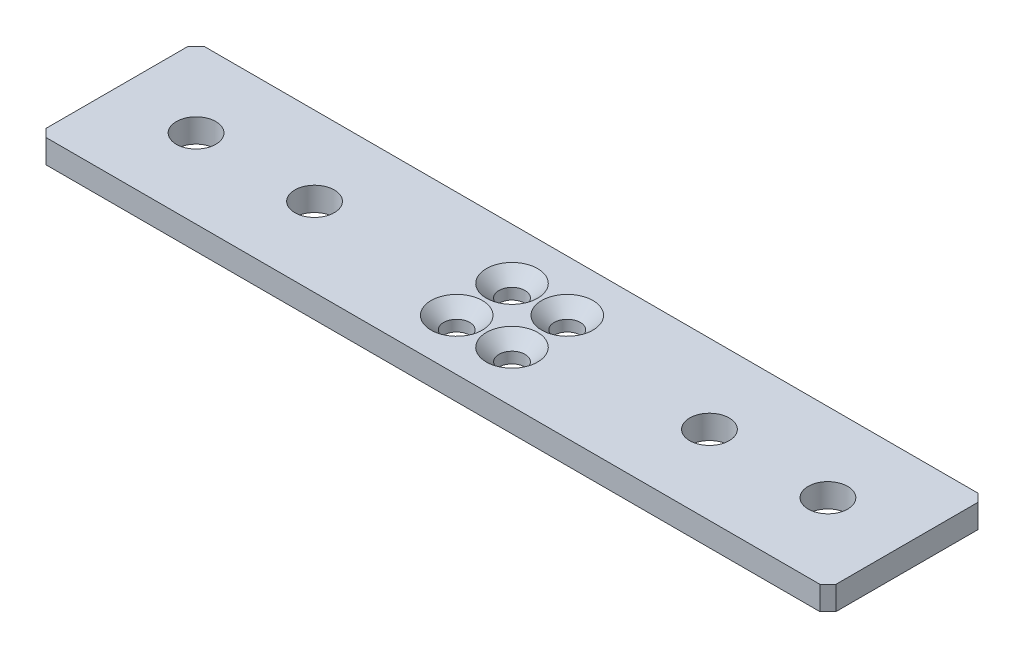
ISO-10303-21;
HEADER;
FILE_DESCRIPTION(('STEP AP214'),'2;1');
FILE_NAME('part.step','',(''),(''),'','','');
FILE_SCHEMA(('AUTOMOTIVE_DESIGN { 1 0 10303 214 1 1 1 1 }'));
ENDSEC;
DATA;
#1=APPLICATION_CONTEXT('core data for automotive mechanical design processes');
#2=APPLICATION_PROTOCOL_DEFINITION('international standard','automotive_design',2000,#1);
#3=PRODUCT_CONTEXT('',#1,'mechanical');
#4=PRODUCT('Part','Part','',(#3));
#5=PRODUCT_RELATED_PRODUCT_CATEGORY('part','',(#4));
#6=PRODUCT_DEFINITION_FORMATION('','',#4);
#7=PRODUCT_DEFINITION_CONTEXT('part definition',#1,'design');
#8=PRODUCT_DEFINITION('design','',#6,#7);
#9=PRODUCT_DEFINITION_SHAPE('','',#8);
#10=(LENGTH_UNIT() NAMED_UNIT(*) SI_UNIT(.MILLI.,.METRE.));
#11=(NAMED_UNIT(*) PLANE_ANGLE_UNIT() SI_UNIT($,.RADIAN.));
#12=(NAMED_UNIT(*) SI_UNIT($,.STERADIAN.) SOLID_ANGLE_UNIT());
#13=UNCERTAINTY_MEASURE_WITH_UNIT(LENGTH_MEASURE(1.E-05),#10,'distance_accuracy_value','');
#14=(GEOMETRIC_REPRESENTATION_CONTEXT(3) GLOBAL_UNCERTAINTY_ASSIGNED_CONTEXT((#13)) GLOBAL_UNIT_ASSIGNED_CONTEXT((#10,
#11,#12)) REPRESENTATION_CONTEXT('',''));
#15=CARTESIAN_POINT('',(0.,0.,0.));
#16=DIRECTION('',(0.,0.,1.));
#17=DIRECTION('',(1.,0.,0.));
#18=AXIS2_PLACEMENT_3D('',#15,#16,#17);
#19=CARTESIAN_POINT('',(100.,6.,20.));
#20=DIRECTION('',(0.,0.,-1.));
#21=DIRECTION('',(-1.,0.,0.));
#22=AXIS2_PLACEMENT_3D('',#19,#20,#21);
#23=PLANE('',#22);
#24=DIRECTION('',(1.,0.,0.));
#25=VECTOR('',#24,1.);
#26=CARTESIAN_POINT('',(100.,0.,20.));
#27=LINE('',#26,#25);
#28=CARTESIAN_POINT('',(-98.,0.,20.));
#29=VERTEX_POINT('',#28);
#30=CARTESIAN_POINT('',(98.,0.,20.));
#31=VERTEX_POINT('',#30);
#32=EDGE_CURVE('E136',#29,#31,#27,.T.);
#33=ORIENTED_EDGE('',*,*,#32,.T.);
#34=DIRECTION('',(0.,1.,0.));
#35=VECTOR('',#34,1.);
#36=CARTESIAN_POINT('',(98.,6.,20.));
#37=LINE('',#36,#35);
#38=CARTESIAN_POINT('',(98.,6.,20.));
#39=VERTEX_POINT('',#38);
#40=EDGE_CURVE('E159',#31,#39,#37,.T.);
#41=ORIENTED_EDGE('',*,*,#40,.T.);
#42=DIRECTION('',(1.,0.,0.));
#43=VECTOR('',#42,1.);
#44=CARTESIAN_POINT('',(100.,6.,20.));
#45=LINE('',#44,#43);
#46=CARTESIAN_POINT('',(-98.,6.,20.));
#47=VERTEX_POINT('',#46);
#48=EDGE_CURVE('E134',#47,#39,#45,.T.);
#49=ORIENTED_EDGE('',*,*,#48,.F.);
#50=DIRECTION('',(0.,-1.,0.));
#51=VECTOR('',#50,1.);
#52=CARTESIAN_POINT('',(-98.,6.,20.));
#53=LINE('',#52,#51);
#54=EDGE_CURVE('E156',#47,#29,#53,.T.);
#55=ORIENTED_EDGE('',*,*,#54,.T.);
#56=EDGE_LOOP('',(#33,#41,#49,#55));
#57=FACE_BOUND('',#56,.T.);
#58=ADVANCED_FACE('F40',(#57),#23,.F.);
#59=CARTESIAN_POINT('',(100.,6.,-20.));
#60=DIRECTION('',(-1.,0.,0.));
#61=DIRECTION('',(0.,0.,1.));
#62=AXIS2_PLACEMENT_3D('',#59,#60,#61);
#63=PLANE('',#62);
#64=DIRECTION('',(0.,0.,-1.));
#65=VECTOR('',#64,1.);
#66=CARTESIAN_POINT('',(100.,0.,-20.));
#67=LINE('',#66,#65);
#68=CARTESIAN_POINT('',(100.,0.,18.));
#69=VERTEX_POINT('',#68);
#70=CARTESIAN_POINT('',(100.,0.,-18.));
#71=VERTEX_POINT('',#70);
#72=EDGE_CURVE('E132',#69,#71,#67,.T.);
#73=ORIENTED_EDGE('',*,*,#72,.T.);
#74=DIRECTION('',(0.,1.,0.));
#75=VECTOR('',#74,1.);
#76=CARTESIAN_POINT('',(100.,6.,-18.));
#77=LINE('',#76,#75);
#78=CARTESIAN_POINT('',(100.,6.,-18.));
#79=VERTEX_POINT('',#78);
#80=EDGE_CURVE('E111',#71,#79,#77,.T.);
#81=ORIENTED_EDGE('',*,*,#80,.T.);
#82=DIRECTION('',(0.,0.,-1.));
#83=VECTOR('',#82,1.);
#84=CARTESIAN_POINT('',(100.,6.,-20.));
#85=LINE('',#84,#83);
#86=CARTESIAN_POINT('',(100.,6.,18.));
#87=VERTEX_POINT('',#86);
#88=EDGE_CURVE('E175',#87,#79,#85,.T.);
#89=ORIENTED_EDGE('',*,*,#88,.F.);
#90=DIRECTION('',(0.,-1.,0.));
#91=VECTOR('',#90,1.);
#92=CARTESIAN_POINT('',(100.,6.,18.));
#93=LINE('',#92,#91);
#94=EDGE_CURVE('E116',#87,#69,#93,.T.);
#95=ORIENTED_EDGE('',*,*,#94,.T.);
#96=EDGE_LOOP('',(#73,#81,#89,#95));
#97=FACE_BOUND('',#96,.T.);
#98=ADVANCED_FACE('F289',(#97),#63,.F.);
#99=CARTESIAN_POINT('',(100.,6.,-20.));
#100=DIRECTION('',(0.,0.,1.));
#101=DIRECTION('',(1.,0.,0.));
#102=AXIS2_PLACEMENT_3D('',#99,#100,#101);
#103=PLANE('',#102);
#104=DIRECTION('',(-1.,0.,0.));
#105=VECTOR('',#104,1.);
#106=CARTESIAN_POINT('',(100.,6.,-20.));
#107=LINE('',#106,#105);
#108=CARTESIAN_POINT('',(98.,6.,-20.));
#109=VERTEX_POINT('',#108);
#110=CARTESIAN_POINT('',(-98.,6.,-20.));
#111=VERTEX_POINT('',#110);
#112=EDGE_CURVE('E125',#109,#111,#107,.T.);
#113=ORIENTED_EDGE('',*,*,#112,.F.);
#114=DIRECTION('',(0.,-1.,0.));
#115=VECTOR('',#114,1.);
#116=CARTESIAN_POINT('',(98.,6.,-20.));
#117=LINE('',#116,#115);
#118=CARTESIAN_POINT('',(98.,0.,-20.));
#119=VERTEX_POINT('',#118);
#120=EDGE_CURVE('E110',#109,#119,#117,.T.);
#121=ORIENTED_EDGE('',*,*,#120,.T.);
#122=DIRECTION('',(-1.,0.,0.));
#123=VECTOR('',#122,1.);
#124=CARTESIAN_POINT('',(100.,0.,-20.));
#125=LINE('',#124,#123);
#126=CARTESIAN_POINT('',(-98.,0.,-20.));
#127=VERTEX_POINT('',#126);
#128=EDGE_CURVE('E123',#119,#127,#125,.T.);
#129=ORIENTED_EDGE('',*,*,#128,.T.);
#130=DIRECTION('',(0.,1.,0.));
#131=VECTOR('',#130,1.);
#132=CARTESIAN_POINT('',(-98.,6.,-20.));
#133=LINE('',#132,#131);
#134=EDGE_CURVE('E127',#127,#111,#133,.T.);
#135=ORIENTED_EDGE('',*,*,#134,.T.);
#136=EDGE_LOOP('',(#113,#121,#129,#135));
#137=FACE_BOUND('',#136,.T.);
#138=ADVANCED_FACE('F122',(#137),#103,.F.);
#139=CARTESIAN_POINT('',(-100.,6.,-20.));
#140=DIRECTION('',(1.,0.,0.));
#141=DIRECTION('',(0.,0.,-1.));
#142=AXIS2_PLACEMENT_3D('',#139,#140,#141);
#143=PLANE('',#142);
#144=DIRECTION('',(0.,0.,1.));
#145=VECTOR('',#144,1.);
#146=CARTESIAN_POINT('',(-100.,0.,-20.));
#147=LINE('',#146,#145);
#148=CARTESIAN_POINT('',(-100.,0.,-18.));
#149=VERTEX_POINT('',#148);
#150=CARTESIAN_POINT('',(-100.,0.,18.));
#151=VERTEX_POINT('',#150);
#152=EDGE_CURVE('E131',#149,#151,#147,.T.);
#153=ORIENTED_EDGE('',*,*,#152,.T.);
#154=DIRECTION('',(0.,1.,0.));
#155=VECTOR('',#154,1.);
#156=CARTESIAN_POINT('',(-100.,6.,18.));
#157=LINE('',#156,#155);
#158=CARTESIAN_POINT('',(-100.,6.,18.));
#159=VERTEX_POINT('',#158);
#160=EDGE_CURVE('E11',#151,#159,#157,.T.);
#161=ORIENTED_EDGE('',*,*,#160,.T.);
#162=DIRECTION('',(0.,0.,1.));
#163=VECTOR('',#162,1.);
#164=CARTESIAN_POINT('',(-100.,6.,-20.));
#165=LINE('',#164,#163);
#166=CARTESIAN_POINT('',(-100.,6.,-18.));
#167=VERTEX_POINT('',#166);
#168=EDGE_CURVE('E140',#167,#159,#165,.T.);
#169=ORIENTED_EDGE('',*,*,#168,.F.);
#170=DIRECTION('',(0.,-1.,0.));
#171=VECTOR('',#170,1.);
#172=CARTESIAN_POINT('',(-100.,6.,-18.));
#173=LINE('',#172,#171);
#174=EDGE_CURVE('E49',#167,#149,#173,.T.);
#175=ORIENTED_EDGE('',*,*,#174,.T.);
#176=EDGE_LOOP('',(#153,#161,#169,#175));
#177=FACE_BOUND('',#176,.T.);
#178=ADVANCED_FACE('F162',(#177),#143,.F.);
#179=CARTESIAN_POINT('',(0.,6.,0.));
#180=DIRECTION('',(0.,1.,0.));
#181=DIRECTION('',(0.,0.,1.));
#182=AXIS2_PLACEMENT_3D('',#179,#180,#181);
#183=PLANE('',#182);
#184=CARTESIAN_POINT('',(50.,6.,0.));
#185=DIRECTION('',(0.,-1.,0.));
#186=DIRECTION('',(0.,0.,1.));
#187=AXIS2_PLACEMENT_3D('',#184,#185,#186);
#188=CIRCLE('',#187,5.);
#189=CARTESIAN_POINT('',(50.,6.,5.));
#190=VERTEX_POINT('',#189);
#191=EDGE_CURVE('E241',#190,#190,#188,.T.);
#192=ORIENTED_EDGE('',*,*,#191,.T.);
#193=EDGE_LOOP('',(#192));
#194=FACE_BOUND('',#193,.T.);
#195=CARTESIAN_POINT('',(80.,6.,2.09488880330588E-13));
#196=DIRECTION('',(0.,-1.,0.));
#197=DIRECTION('',(0.,0.,1.));
#198=AXIS2_PLACEMENT_3D('',#195,#196,#197);
#199=CIRCLE('',#198,4.99999999999999);
#200=CARTESIAN_POINT('',(80.,6.,5.0000000000002));
#201=VERTEX_POINT('',#200);
#202=EDGE_CURVE('E235',#201,#201,#199,.T.);
#203=ORIENTED_EDGE('',*,*,#202,.T.);
#204=EDGE_LOOP('',(#203));
#205=FACE_BOUND('',#204,.T.);
#206=CARTESIAN_POINT('',(-50.,6.,0.));
#207=DIRECTION('',(0.,1.,0.));
#208=DIRECTION('',(0.,0.,1.));
#209=AXIS2_PLACEMENT_3D('',#206,#207,#208);
#210=CIRCLE('',#209,5.);
#211=CARTESIAN_POINT('',(-50.,6.,5.));
#212=VERTEX_POINT('',#211);
#213=EDGE_CURVE('E230',#212,#212,#210,.T.);
#214=ORIENTED_EDGE('',*,*,#213,.F.);
#215=EDGE_LOOP('',(#214));
#216=FACE_BOUND('',#215,.T.);
#217=CARTESIAN_POINT('',(-80.,6.,2.09488880330588E-13));
#218=DIRECTION('',(0.,1.,0.));
#219=DIRECTION('',(0.,0.,1.));
#220=AXIS2_PLACEMENT_3D('',#217,#218,#219);
#221=CIRCLE('',#220,4.99999999999999);
#222=CARTESIAN_POINT('',(-80.,6.,5.0000000000002));
#223=VERTEX_POINT('',#222);
#224=EDGE_CURVE('E223',#223,#223,#221,.T.);
#225=ORIENTED_EDGE('',*,*,#224,.F.);
#226=EDGE_LOOP('',(#225));
#227=FACE_BOUND('',#226,.T.);
#228=CARTESIAN_POINT('',(-7.,6.,-7.));
#229=DIRECTION('',(0.,1.,0.));
#230=DIRECTION('',(0.,0.,1.));
#231=AXIS2_PLACEMENT_3D('',#228,#229,#230);
#232=CIRCLE('',#231,6.5);
#233=CARTESIAN_POINT('',(-7.,6.,-0.5));
#234=VERTEX_POINT('',#233);
#235=EDGE_CURVE('E219',#234,#234,#232,.T.);
#236=ORIENTED_EDGE('',*,*,#235,.F.);
#237=EDGE_LOOP('',(#236));
#238=FACE_BOUND('',#237,.T.);
#239=CARTESIAN_POINT('',(7.,6.,-7.));
#240=DIRECTION('',(0.,1.,0.));
#241=DIRECTION('',(0.,0.,1.));
#242=AXIS2_PLACEMENT_3D('',#239,#240,#241);
#243=CIRCLE('',#242,6.5);
#244=CARTESIAN_POINT('',(7.,6.,-0.5));
#245=VERTEX_POINT('',#244);
#246=EDGE_CURVE('E210',#245,#245,#243,.T.);
#247=ORIENTED_EDGE('',*,*,#246,.F.);
#248=EDGE_LOOP('',(#247));
#249=FACE_BOUND('',#248,.T.);
#250=CARTESIAN_POINT('',(7.,6.,7.));
#251=DIRECTION('',(0.,1.,0.));
#252=DIRECTION('',(0.,0.,1.));
#253=AXIS2_PLACEMENT_3D('',#250,#251,#252);
#254=CIRCLE('',#253,6.5);
#255=CARTESIAN_POINT('',(7.,6.,13.5));
#256=VERTEX_POINT('',#255);
#257=EDGE_CURVE('E201',#256,#256,#254,.T.);
#258=ORIENTED_EDGE('',*,*,#257,.F.);
#259=EDGE_LOOP('',(#258));
#260=FACE_BOUND('',#259,.T.);
#261=CARTESIAN_POINT('',(-7.,6.,7.));
#262=DIRECTION('',(0.,1.,0.));
#263=DIRECTION('',(0.,0.,1.));
#264=AXIS2_PLACEMENT_3D('',#261,#262,#263);
#265=CIRCLE('',#264,6.5);
#266=CARTESIAN_POINT('',(-7.,6.,13.5));
#267=VERTEX_POINT('',#266);
#268=EDGE_CURVE('E189',#267,#267,#265,.T.);
#269=ORIENTED_EDGE('',*,*,#268,.F.);
#270=EDGE_LOOP('',(#269));
#271=FACE_BOUND('',#270,.T.);
#272=ORIENTED_EDGE('',*,*,#88,.T.);
#273=DIRECTION('',(0.707106781186543,0.,0.707106781186552));
#274=VECTOR('',#273,1.);
#275=CARTESIAN_POINT('',(59.0000000000007,6.,-58.9999999999999));
#276=LINE('',#275,#274);
#277=EDGE_CURVE('E154',#79,#109,#276,.F.);
#278=ORIENTED_EDGE('',*,*,#277,.T.);
#279=ORIENTED_EDGE('',*,*,#112,.T.);
#280=DIRECTION('',(0.707106781186548,0.,-0.707106781186548));
#281=VECTOR('',#280,1.);
#282=CARTESIAN_POINT('',(-59.,6.,-59.));
#283=LINE('',#282,#281);
#284=EDGE_CURVE('E61',#111,#167,#283,.F.);
#285=ORIENTED_EDGE('',*,*,#284,.T.);
#286=ORIENTED_EDGE('',*,*,#168,.T.);
#287=DIRECTION('',(-0.707106781186543,0.,-0.707106781186552));
#288=VECTOR('',#287,1.);
#289=CARTESIAN_POINT('',(-59.0000000000007,6.,58.9999999999999));
#290=LINE('',#289,#288);
#291=EDGE_CURVE('E150',#159,#47,#290,.F.);
#292=ORIENTED_EDGE('',*,*,#291,.T.);
#293=ORIENTED_EDGE('',*,*,#48,.T.);
#294=DIRECTION('',(-0.707106781186548,0.,0.707106781186548));
#295=VECTOR('',#294,1.);
#296=CARTESIAN_POINT('',(59.,6.,59.));
#297=LINE('',#296,#295);
#298=EDGE_CURVE('E152',#39,#87,#297,.F.);
#299=ORIENTED_EDGE('',*,*,#298,.T.);
#300=EDGE_LOOP('',(#272,#278,#279,#285,#286,#292,#293,#299));
#301=FACE_BOUND('',#300,.T.);
#302=ADVANCED_FACE('F253',(#194,#205,#216,#227,#238,#249,#260,#271,#301),#183,.T.);
#303=CARTESIAN_POINT('',(0.,0.,0.));
#304=DIRECTION('',(0.,1.,0.));
#305=DIRECTION('',(0.,0.,1.));
#306=AXIS2_PLACEMENT_3D('',#303,#304,#305);
#307=PLANE('',#306);
#308=CARTESIAN_POINT('',(50.,0.,0.));
#309=DIRECTION('',(0.,-1.,0.));
#310=DIRECTION('',(0.,0.,1.));
#311=AXIS2_PLACEMENT_3D('',#308,#309,#310);
#312=CIRCLE('',#311,5.);
#313=CARTESIAN_POINT('',(50.,0.,5.));
#314=VERTEX_POINT('',#313);
#315=EDGE_CURVE('E227',#314,#314,#312,.T.);
#316=ORIENTED_EDGE('',*,*,#315,.F.);
#317=EDGE_LOOP('',(#316));
#318=FACE_BOUND('',#317,.T.);
#319=CARTESIAN_POINT('',(80.,0.,2.09488880330588E-13));
#320=DIRECTION('',(0.,-1.,0.));
#321=DIRECTION('',(0.,0.,1.));
#322=AXIS2_PLACEMENT_3D('',#319,#320,#321);
#323=CIRCLE('',#322,4.99999999999999);
#324=CARTESIAN_POINT('',(80.,0.,5.0000000000002));
#325=VERTEX_POINT('',#324);
#326=EDGE_CURVE('E238',#325,#325,#323,.T.);
#327=ORIENTED_EDGE('',*,*,#326,.F.);
#328=EDGE_LOOP('',(#327));
#329=FACE_BOUND('',#328,.T.);
#330=CARTESIAN_POINT('',(-50.,0.,0.));
#331=DIRECTION('',(0.,1.,0.));
#332=DIRECTION('',(0.,0.,1.));
#333=AXIS2_PLACEMENT_3D('',#330,#331,#332);
#334=CIRCLE('',#333,5.);
#335=CARTESIAN_POINT('',(-50.,0.,5.));
#336=VERTEX_POINT('',#335);
#337=EDGE_CURVE('E222',#336,#336,#334,.T.);
#338=ORIENTED_EDGE('',*,*,#337,.T.);
#339=EDGE_LOOP('',(#338));
#340=FACE_BOUND('',#339,.T.);
#341=CARTESIAN_POINT('',(-80.,0.,2.09488880330588E-13));
#342=DIRECTION('',(0.,1.,0.));
#343=DIRECTION('',(0.,0.,1.));
#344=AXIS2_PLACEMENT_3D('',#341,#342,#343);
#345=CIRCLE('',#344,4.99999999999999);
#346=CARTESIAN_POINT('',(-80.,0.,5.0000000000002));
#347=VERTEX_POINT('',#346);
#348=EDGE_CURVE('E226',#347,#347,#345,.T.);
#349=ORIENTED_EDGE('',*,*,#348,.T.);
#350=EDGE_LOOP('',(#349));
#351=FACE_BOUND('',#350,.T.);
#352=CARTESIAN_POINT('',(-7.,0.,-7.));
#353=DIRECTION('',(0.,1.,0.));
#354=DIRECTION('',(0.,0.,1.));
#355=AXIS2_PLACEMENT_3D('',#352,#353,#354);
#356=CIRCLE('',#355,3.3);
#357=CARTESIAN_POINT('',(-7.,0.,-3.7));
#358=VERTEX_POINT('',#357);
#359=EDGE_CURVE('E213',#358,#358,#356,.T.);
#360=ORIENTED_EDGE('',*,*,#359,.T.);
#361=EDGE_LOOP('',(#360));
#362=FACE_BOUND('',#361,.T.);
#363=CARTESIAN_POINT('',(7.,0.,-7.));
#364=DIRECTION('',(0.,1.,0.));
#365=DIRECTION('',(0.,0.,1.));
#366=AXIS2_PLACEMENT_3D('',#363,#364,#365);
#367=CIRCLE('',#366,3.3);
#368=CARTESIAN_POINT('',(7.,0.,-3.7));
#369=VERTEX_POINT('',#368);
#370=EDGE_CURVE('E204',#369,#369,#367,.T.);
#371=ORIENTED_EDGE('',*,*,#370,.T.);
#372=EDGE_LOOP('',(#371));
#373=FACE_BOUND('',#372,.T.);
#374=CARTESIAN_POINT('',(7.,0.,7.));
#375=DIRECTION('',(0.,1.,0.));
#376=DIRECTION('',(0.,0.,1.));
#377=AXIS2_PLACEMENT_3D('',#374,#375,#376);
#378=CIRCLE('',#377,3.3);
#379=CARTESIAN_POINT('',(7.,0.,10.3));
#380=VERTEX_POINT('',#379);
#381=EDGE_CURVE('E193',#380,#380,#378,.T.);
#382=ORIENTED_EDGE('',*,*,#381,.T.);
#383=EDGE_LOOP('',(#382));
#384=FACE_BOUND('',#383,.T.);
#385=CARTESIAN_POINT('',(-7.,0.,7.));
#386=DIRECTION('',(0.,1.,0.));
#387=DIRECTION('',(0.,0.,1.));
#388=AXIS2_PLACEMENT_3D('',#385,#386,#387);
#389=CIRCLE('',#388,3.3);
#390=CARTESIAN_POINT('',(-7.,0.,10.3));
#391=VERTEX_POINT('',#390);
#392=EDGE_CURVE('E180',#391,#391,#389,.T.);
#393=ORIENTED_EDGE('',*,*,#392,.T.);
#394=EDGE_LOOP('',(#393));
#395=FACE_BOUND('',#394,.T.);
#396=ORIENTED_EDGE('',*,*,#128,.F.);
#397=DIRECTION('',(-0.707106781186543,0.,-0.707106781186552));
#398=VECTOR('',#397,1.);
#399=CARTESIAN_POINT('',(98.,0.,-20.));
#400=LINE('',#399,#398);
#401=EDGE_CURVE('E106',#119,#71,#400,.F.);
#402=ORIENTED_EDGE('',*,*,#401,.T.);
#403=ORIENTED_EDGE('',*,*,#72,.F.);
#404=DIRECTION('',(0.707106781186548,0.,-0.707106781186548));
#405=VECTOR('',#404,1.);
#406=CARTESIAN_POINT('',(100.,0.,18.));
#407=LINE('',#406,#405);
#408=EDGE_CURVE('E117',#69,#31,#407,.F.);
#409=ORIENTED_EDGE('',*,*,#408,.T.);
#410=ORIENTED_EDGE('',*,*,#32,.F.);
#411=DIRECTION('',(0.707106781186543,0.,0.707106781186552));
#412=VECTOR('',#411,1.);
#413=CARTESIAN_POINT('',(-98.,0.,20.));
#414=LINE('',#413,#412);
#415=EDGE_CURVE('E143',#29,#151,#414,.F.);
#416=ORIENTED_EDGE('',*,*,#415,.T.);
#417=ORIENTED_EDGE('',*,*,#152,.F.);
#418=DIRECTION('',(-0.707106781186548,0.,0.707106781186548));
#419=VECTOR('',#418,1.);
#420=CARTESIAN_POINT('',(-100.,0.,-18.));
#421=LINE('',#420,#419);
#422=EDGE_CURVE('E126',#149,#127,#421,.F.);
#423=ORIENTED_EDGE('',*,*,#422,.T.);
#424=EDGE_LOOP('',(#396,#402,#403,#409,#410,#416,#417,#423));
#425=FACE_BOUND('',#424,.T.);
#426=ADVANCED_FACE('F129',(#318,#329,#340,#351,#362,#373,#384,#395,#425),#307,.F.);
#427=CARTESIAN_POINT('',(-7.,6.,7.));
#428=DIRECTION('',(0.,1.,0.));
#429=DIRECTION('',(0.,0.,1.));
#430=AXIS2_PLACEMENT_3D('',#427,#428,#429);
#431=CYLINDRICAL_SURFACE('',#430,3.3);
#432=ORIENTED_EDGE('',*,*,#392,.F.);
#433=EDGE_LOOP('',(#432));
#434=FACE_BOUND('',#433,.T.);
#435=CARTESIAN_POINT('',(-7.,2.8,7.));
#436=DIRECTION('',(0.,1.,0.));
#437=DIRECTION('',(0.,0.,1.));
#438=AXIS2_PLACEMENT_3D('',#435,#436,#437);
#439=CIRCLE('',#438,3.3);
#440=CARTESIAN_POINT('',(-7.,2.8,10.3));
#441=VERTEX_POINT('',#440);
#442=EDGE_CURVE('E185',#441,#441,#439,.T.);
#443=ORIENTED_EDGE('',*,*,#442,.T.);
#444=EDGE_LOOP('',(#443));
#445=FACE_BOUND('',#444,.T.);
#446=ADVANCED_FACE('F252',(#434,#445),#431,.F.);
#447=CARTESIAN_POINT('',(-7.,6.,7.));
#448=DIRECTION('',(0.,1.,0.));
#449=DIRECTION('',(0.,0.,1.));
#450=AXIS2_PLACEMENT_3D('',#447,#448,#449);
#451=CONICAL_SURFACE('',#450,6.5,0.785398163397448);
#452=ORIENTED_EDGE('',*,*,#442,.F.);
#453=EDGE_LOOP('',(#452));
#454=FACE_BOUND('',#453,.T.);
#455=ORIENTED_EDGE('',*,*,#268,.T.);
#456=EDGE_LOOP('',(#455));
#457=FACE_BOUND('',#456,.T.);
#458=ADVANCED_FACE('F271',(#454,#457),#451,.F.);
#459=CARTESIAN_POINT('',(7.,6.,7.));
#460=DIRECTION('',(0.,1.,0.));
#461=DIRECTION('',(0.,0.,1.));
#462=AXIS2_PLACEMENT_3D('',#459,#460,#461);
#463=CYLINDRICAL_SURFACE('',#462,3.3);
#464=ORIENTED_EDGE('',*,*,#381,.F.);
#465=EDGE_LOOP('',(#464));
#466=FACE_BOUND('',#465,.T.);
#467=CARTESIAN_POINT('',(7.,2.8,7.));
#468=DIRECTION('',(0.,1.,0.));
#469=DIRECTION('',(0.,0.,1.));
#470=AXIS2_PLACEMENT_3D('',#467,#468,#469);
#471=CIRCLE('',#470,3.3);
#472=CARTESIAN_POINT('',(7.,2.8,10.3));
#473=VERTEX_POINT('',#472);
#474=EDGE_CURVE('E198',#473,#473,#471,.T.);
#475=ORIENTED_EDGE('',*,*,#474,.T.);
#476=EDGE_LOOP('',(#475));
#477=FACE_BOUND('',#476,.T.);
#478=ADVANCED_FACE('F267',(#466,#477),#463,.F.);
#479=CARTESIAN_POINT('',(7.,6.,7.));
#480=DIRECTION('',(0.,1.,0.));
#481=DIRECTION('',(0.,0.,1.));
#482=AXIS2_PLACEMENT_3D('',#479,#480,#481);
#483=CONICAL_SURFACE('',#482,6.5,0.785398163397448);
#484=ORIENTED_EDGE('',*,*,#474,.F.);
#485=EDGE_LOOP('',(#484));
#486=FACE_BOUND('',#485,.T.);
#487=ORIENTED_EDGE('',*,*,#257,.T.);
#488=EDGE_LOOP('',(#487));
#489=FACE_BOUND('',#488,.T.);
#490=ADVANCED_FACE('F270',(#486,#489),#483,.F.);
#491=CARTESIAN_POINT('',(7.,6.,-7.));
#492=DIRECTION('',(0.,1.,0.));
#493=DIRECTION('',(0.,0.,1.));
#494=AXIS2_PLACEMENT_3D('',#491,#492,#493);
#495=CYLINDRICAL_SURFACE('',#494,3.3);
#496=ORIENTED_EDGE('',*,*,#370,.F.);
#497=EDGE_LOOP('',(#496));
#498=FACE_BOUND('',#497,.T.);
#499=CARTESIAN_POINT('',(7.,2.8,-7.));
#500=DIRECTION('',(0.,1.,0.));
#501=DIRECTION('',(0.,0.,1.));
#502=AXIS2_PLACEMENT_3D('',#499,#500,#501);
#503=CIRCLE('',#502,3.3);
#504=CARTESIAN_POINT('',(7.,2.8,-3.7));
#505=VERTEX_POINT('',#504);
#506=EDGE_CURVE('E207',#505,#505,#503,.T.);
#507=ORIENTED_EDGE('',*,*,#506,.T.);
#508=EDGE_LOOP('',(#507));
#509=FACE_BOUND('',#508,.T.);
#510=ADVANCED_FACE('F277',(#498,#509),#495,.F.);
#511=CARTESIAN_POINT('',(7.,6.,-7.));
#512=DIRECTION('',(0.,1.,0.));
#513=DIRECTION('',(0.,0.,1.));
#514=AXIS2_PLACEMENT_3D('',#511,#512,#513);
#515=CONICAL_SURFACE('',#514,6.5,0.785398163397448);
#516=ORIENTED_EDGE('',*,*,#506,.F.);
#517=EDGE_LOOP('',(#516));
#518=FACE_BOUND('',#517,.T.);
#519=ORIENTED_EDGE('',*,*,#246,.T.);
#520=EDGE_LOOP('',(#519));
#521=FACE_BOUND('',#520,.T.);
#522=ADVANCED_FACE('F330',(#518,#521),#515,.F.);
#523=CARTESIAN_POINT('',(-7.,6.,-7.));
#524=DIRECTION('',(0.,1.,0.));
#525=DIRECTION('',(0.,0.,1.));
#526=AXIS2_PLACEMENT_3D('',#523,#524,#525);
#527=CYLINDRICAL_SURFACE('',#526,3.3);
#528=ORIENTED_EDGE('',*,*,#359,.F.);
#529=EDGE_LOOP('',(#528));
#530=FACE_BOUND('',#529,.T.);
#531=CARTESIAN_POINT('',(-7.,2.8,-7.));
#532=DIRECTION('',(0.,1.,0.));
#533=DIRECTION('',(0.,0.,1.));
#534=AXIS2_PLACEMENT_3D('',#531,#532,#533);
#535=CIRCLE('',#534,3.3);
#536=CARTESIAN_POINT('',(-7.,2.8,-3.7));
#537=VERTEX_POINT('',#536);
#538=EDGE_CURVE('E216',#537,#537,#535,.T.);
#539=ORIENTED_EDGE('',*,*,#538,.T.);
#540=EDGE_LOOP('',(#539));
#541=FACE_BOUND('',#540,.T.);
#542=ADVANCED_FACE('F334',(#530,#541),#527,.F.);
#543=CARTESIAN_POINT('',(-7.,6.,-7.));
#544=DIRECTION('',(0.,1.,0.));
#545=DIRECTION('',(0.,0.,1.));
#546=AXIS2_PLACEMENT_3D('',#543,#544,#545);
#547=CONICAL_SURFACE('',#546,6.5,0.785398163397448);
#548=ORIENTED_EDGE('',*,*,#538,.F.);
#549=EDGE_LOOP('',(#548));
#550=FACE_BOUND('',#549,.T.);
#551=ORIENTED_EDGE('',*,*,#235,.T.);
#552=EDGE_LOOP('',(#551));
#553=FACE_BOUND('',#552,.T.);
#554=ADVANCED_FACE('F298',(#550,#553),#547,.F.);
#555=CARTESIAN_POINT('',(98.,6.,-20.));
#556=DIRECTION('',(-0.707106781186552,0.,0.707106781186543));
#557=DIRECTION('',(0.,-1.,0.));
#558=AXIS2_PLACEMENT_3D('',#555,#556,#557);
#559=PLANE('',#558);
#560=ORIENTED_EDGE('',*,*,#277,.F.);
#561=ORIENTED_EDGE('',*,*,#80,.F.);
#562=ORIENTED_EDGE('',*,*,#401,.F.);
#563=ORIENTED_EDGE('',*,*,#120,.F.);
#564=EDGE_LOOP('',(#560,#561,#562,#563));
#565=FACE_BOUND('',#564,.T.);
#566=ADVANCED_FACE('F109',(#565),#559,.F.);
#567=CARTESIAN_POINT('',(100.,6.,18.));
#568=DIRECTION('',(-0.707106781186547,0.,-0.707106781186547));
#569=DIRECTION('',(0.,-1.,0.));
#570=AXIS2_PLACEMENT_3D('',#567,#568,#569);
#571=PLANE('',#570);
#572=ORIENTED_EDGE('',*,*,#298,.F.);
#573=ORIENTED_EDGE('',*,*,#40,.F.);
#574=ORIENTED_EDGE('',*,*,#408,.F.);
#575=ORIENTED_EDGE('',*,*,#94,.F.);
#576=EDGE_LOOP('',(#572,#573,#574,#575));
#577=FACE_BOUND('',#576,.T.);
#578=ADVANCED_FACE('F291',(#577),#571,.F.);
#579=CARTESIAN_POINT('',(-98.,6.,20.));
#580=DIRECTION('',(0.707106781186552,0.,-0.707106781186543));
#581=DIRECTION('',(0.,-1.,0.));
#582=AXIS2_PLACEMENT_3D('',#579,#580,#581);
#583=PLANE('',#582);
#584=ORIENTED_EDGE('',*,*,#291,.F.);
#585=ORIENTED_EDGE('',*,*,#160,.F.);
#586=ORIENTED_EDGE('',*,*,#415,.F.);
#587=ORIENTED_EDGE('',*,*,#54,.F.);
#588=EDGE_LOOP('',(#584,#585,#586,#587));
#589=FACE_BOUND('',#588,.T.);
#590=ADVANCED_FACE('F169',(#589),#583,.F.);
#591=CARTESIAN_POINT('',(-100.,6.,-18.));
#592=DIRECTION('',(0.707106781186547,0.,0.707106781186547));
#593=DIRECTION('',(0.,-1.,0.));
#594=AXIS2_PLACEMENT_3D('',#591,#592,#593);
#595=PLANE('',#594);
#596=ORIENTED_EDGE('',*,*,#284,.F.);
#597=ORIENTED_EDGE('',*,*,#134,.F.);
#598=ORIENTED_EDGE('',*,*,#422,.F.);
#599=ORIENTED_EDGE('',*,*,#174,.F.);
#600=EDGE_LOOP('',(#596,#597,#598,#599));
#601=FACE_BOUND('',#600,.T.);
#602=ADVANCED_FACE('F43',(#601),#595,.F.);
#603=CARTESIAN_POINT('',(-80.,0.,2.09488880330588E-13));
#604=DIRECTION('',(0.,1.,0.));
#605=DIRECTION('',(0.,0.,1.));
#606=AXIS2_PLACEMENT_3D('',#603,#604,#605);
#607=CYLINDRICAL_SURFACE('',#606,4.99999999999999);
#608=ORIENTED_EDGE('',*,*,#348,.F.);
#609=EDGE_LOOP('',(#608));
#610=FACE_BOUND('',#609,.T.);
#611=ORIENTED_EDGE('',*,*,#224,.T.);
#612=EDGE_LOOP('',(#611));
#613=FACE_BOUND('',#612,.T.);
#614=ADVANCED_FACE('F342',(#610,#613),#607,.F.);
#615=CARTESIAN_POINT('',(-50.,0.,0.));
#616=DIRECTION('',(0.,1.,0.));
#617=DIRECTION('',(0.,0.,1.));
#618=AXIS2_PLACEMENT_3D('',#615,#616,#617);
#619=CYLINDRICAL_SURFACE('',#618,5.);
#620=ORIENTED_EDGE('',*,*,#337,.F.);
#621=EDGE_LOOP('',(#620));
#622=FACE_BOUND('',#621,.T.);
#623=ORIENTED_EDGE('',*,*,#213,.T.);
#624=EDGE_LOOP('',(#623));
#625=FACE_BOUND('',#624,.T.);
#626=ADVANCED_FACE('F345',(#622,#625),#619,.F.);
#627=CARTESIAN_POINT('',(80.,0.,2.09488880330588E-13));
#628=DIRECTION('',(0.,1.,0.));
#629=DIRECTION('',(0.,0.,1.));
#630=AXIS2_PLACEMENT_3D('',#627,#628,#629);
#631=CYLINDRICAL_SURFACE('',#630,4.99999999999999);
#632=ORIENTED_EDGE('',*,*,#326,.T.);
#633=EDGE_LOOP('',(#632));
#634=FACE_BOUND('',#633,.T.);
#635=ORIENTED_EDGE('',*,*,#202,.F.);
#636=EDGE_LOOP('',(#635));
#637=FACE_BOUND('',#636,.T.);
#638=ADVANCED_FACE('F349',(#634,#637),#631,.F.);
#639=CARTESIAN_POINT('',(50.,0.,0.));
#640=DIRECTION('',(0.,1.,0.));
#641=DIRECTION('',(0.,0.,1.));
#642=AXIS2_PLACEMENT_3D('',#639,#640,#641);
#643=CYLINDRICAL_SURFACE('',#642,5.);
#644=ORIENTED_EDGE('',*,*,#315,.T.);
#645=EDGE_LOOP('',(#644));
#646=FACE_BOUND('',#645,.T.);
#647=ORIENTED_EDGE('',*,*,#191,.F.);
#648=EDGE_LOOP('',(#647));
#649=FACE_BOUND('',#648,.T.);
#650=ADVANCED_FACE('F247',(#646,#649),#643,.F.);
#651=CLOSED_SHELL('',(#58,#98,#138,#178,#302,#426,#446,#458,#478,#490,#510,#522,#542,#554,#566,
#578,#590,#602,#614,#626,#638,#650));
#652=MANIFOLD_SOLID_BREP('B2',#651);
#653=ADVANCED_BREP_SHAPE_REPRESENTATION('',(#18,#652),#14);
#654=SHAPE_DEFINITION_REPRESENTATION(#9,#653);
ENDSEC;
END-ISO-10303-21;
